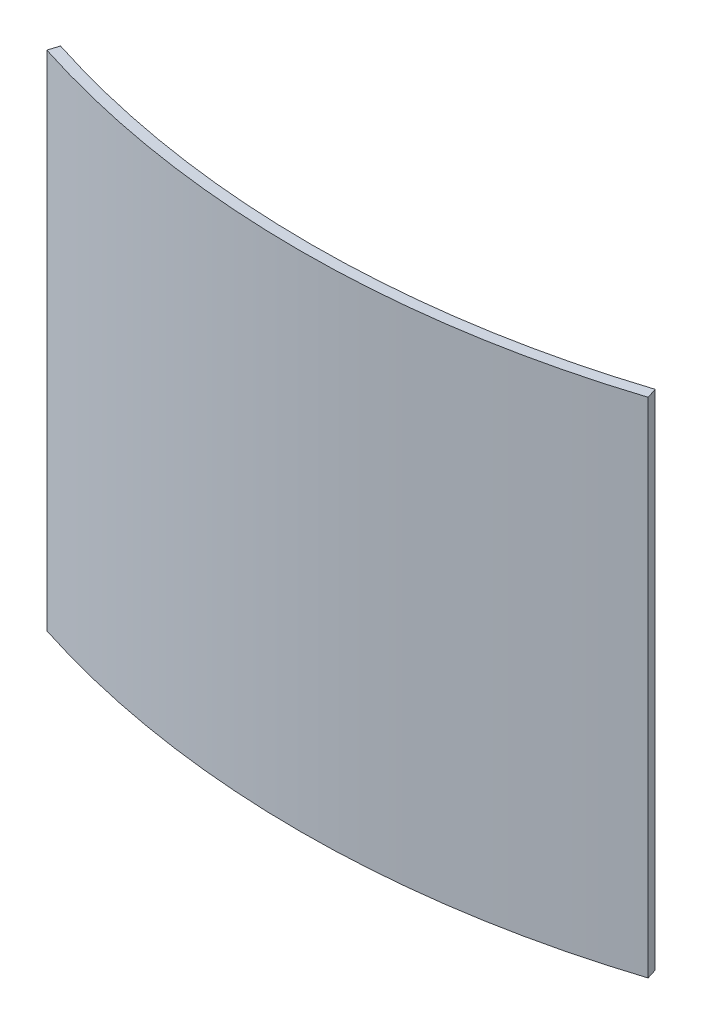
ISO-10303-21;
HEADER;
FILE_DESCRIPTION(('STEP AP214'),'2;1');
FILE_NAME('part.step','',(''),(''),'','','');
FILE_SCHEMA(('AUTOMOTIVE_DESIGN { 1 0 10303 214 1 1 1 1 }'));
ENDSEC;
DATA;
#1=APPLICATION_CONTEXT('core data for automotive mechanical design processes');
#2=APPLICATION_PROTOCOL_DEFINITION('international standard','automotive_design',2000,#1);
#3=PRODUCT_CONTEXT('',#1,'mechanical');
#4=PRODUCT('Part','Part','',(#3));
#5=PRODUCT_RELATED_PRODUCT_CATEGORY('part','',(#4));
#6=PRODUCT_DEFINITION_FORMATION('','',#4);
#7=PRODUCT_DEFINITION_CONTEXT('part definition',#1,'design');
#8=PRODUCT_DEFINITION('design','',#6,#7);
#9=PRODUCT_DEFINITION_SHAPE('','',#8);
#10=(LENGTH_UNIT() NAMED_UNIT(*) SI_UNIT(.MILLI.,.METRE.));
#11=(NAMED_UNIT(*) PLANE_ANGLE_UNIT() SI_UNIT($,.RADIAN.));
#12=(NAMED_UNIT(*) SI_UNIT($,.STERADIAN.) SOLID_ANGLE_UNIT());
#13=UNCERTAINTY_MEASURE_WITH_UNIT(LENGTH_MEASURE(1.E-05),#10,'distance_accuracy_value','');
#14=(GEOMETRIC_REPRESENTATION_CONTEXT(3) GLOBAL_UNCERTAINTY_ASSIGNED_CONTEXT((#13)) GLOBAL_UNIT_ASSIGNED_CONTEXT((#10,
#11,#12)) REPRESENTATION_CONTEXT('',''));
#15=CARTESIAN_POINT('',(0.,0.,0.));
#16=DIRECTION('',(0.,0.,1.));
#17=DIRECTION('',(1.,0.,0.));
#18=AXIS2_PLACEMENT_3D('',#15,#16,#17);
#19=CARTESIAN_POINT('',(0.,-230.,-856.956825050131));
#20=DIRECTION('',(0.,1.,0.));
#21=DIRECTION('',(0.,0.,1.));
#22=AXIS2_PLACEMENT_3D('',#19,#20,#21);
#23=CYLINDRICAL_SURFACE('',#22,890.);
#24=DIRECTION('',(0.,1.,0.));
#25=VECTOR('',#24,1.);
#26=CARTESIAN_POINT('',(-271.944444444444,-230.,-9.52174250055693));
#27=LINE('',#26,#25);
#28=CARTESIAN_POINT('',(-271.944444444444,-230.,-9.52174250055693));
#29=VERTEX_POINT('',#28);
#30=CARTESIAN_POINT('',(-271.944444444444,230.,-9.52174250055693));
#31=VERTEX_POINT('',#30);
#32=EDGE_CURVE('E45',#29,#31,#27,.T.);
#33=ORIENTED_EDGE('',*,*,#32,.T.);
#34=CARTESIAN_POINT('',(0.,230.,-856.956825050131));
#35=DIRECTION('',(0.,1.,0.));
#36=DIRECTION('',(1.,0.,0.));
#37=AXIS2_PLACEMENT_3D('',#34,#35,#36);
#38=CIRCLE('',#37,890.);
#39=CARTESIAN_POINT('',(271.944444444444,230.,-9.52174250055682));
#40=VERTEX_POINT('',#39);
#41=EDGE_CURVE('E82',#40,#31,#38,.F.);
#42=ORIENTED_EDGE('',*,*,#41,.F.);
#43=DIRECTION('',(0.,1.,0.));
#44=VECTOR('',#43,1.);
#45=CARTESIAN_POINT('',(271.944444444444,-230.,-9.52174250055682));
#46=LINE('',#45,#44);
#47=CARTESIAN_POINT('',(271.944444444444,-230.,-9.52174250055682));
#48=VERTEX_POINT('',#47);
#49=EDGE_CURVE('E11',#48,#40,#46,.T.);
#50=ORIENTED_EDGE('',*,*,#49,.F.);
#51=CARTESIAN_POINT('',(0.,-230.,-856.956825050131));
#52=DIRECTION('',(0.,1.,0.));
#53=DIRECTION('',(1.,0.,0.));
#54=AXIS2_PLACEMENT_3D('',#51,#52,#53);
#55=CIRCLE('',#54,890.);
#56=EDGE_CURVE('E84',#48,#29,#55,.F.);
#57=ORIENTED_EDGE('',*,*,#56,.T.);
#58=EDGE_LOOP('',(#33,#42,#50,#57));
#59=FACE_BOUND('',#58,.T.);
#60=ADVANCED_FACE('F42',(#59),#23,.F.);
#61=CARTESIAN_POINT('',(271.944444444444,-230.,-9.52174250055682));
#62=DIRECTION('',(-0.95217425005568,0.,0.305555555555619));
#63=DIRECTION('',(0.305555555555619,0.,0.95217425005568));
#64=AXIS2_PLACEMENT_3D('',#61,#62,#63);
#65=PLANE('',#64);
#66=ORIENTED_EDGE('',*,*,#49,.T.);
#67=DIRECTION('',(0.305555555555619,0.,0.95217425005568));
#68=VECTOR('',#67,1.);
#69=CARTESIAN_POINT('',(271.944444444444,230.,-9.52174250055682));
#70=LINE('',#69,#68);
#71=CARTESIAN_POINT('',(275.,230.,0.));
#72=VERTEX_POINT('',#71);
#73=EDGE_CURVE('E96',#40,#72,#70,.T.);
#74=ORIENTED_EDGE('',*,*,#73,.T.);
#75=DIRECTION('',(0.,1.,0.));
#76=VECTOR('',#75,1.);
#77=CARTESIAN_POINT('',(275.,-230.,0.));
#78=LINE('',#77,#76);
#79=CARTESIAN_POINT('',(275.,-230.,0.));
#80=VERTEX_POINT('',#79);
#81=EDGE_CURVE('E50',#80,#72,#78,.T.);
#82=ORIENTED_EDGE('',*,*,#81,.F.);
#83=DIRECTION('',(0.305555555555619,0.,0.95217425005568));
#84=VECTOR('',#83,1.);
#85=CARTESIAN_POINT('',(271.944444444444,-230.,-9.52174250055682));
#86=LINE('',#85,#84);
#87=EDGE_CURVE('E63',#48,#80,#86,.T.);
#88=ORIENTED_EDGE('',*,*,#87,.F.);
#89=EDGE_LOOP('',(#66,#74,#82,#88));
#90=FACE_BOUND('',#89,.T.);
#91=ADVANCED_FACE('F115',(#90),#65,.F.);
#92=CARTESIAN_POINT('',(0.,-230.,-856.956825050131));
#93=DIRECTION('',(0.,1.,0.));
#94=DIRECTION('',(0.,0.,1.));
#95=AXIS2_PLACEMENT_3D('',#92,#93,#94);
#96=CYLINDRICAL_SURFACE('',#95,900.);
#97=ORIENTED_EDGE('',*,*,#81,.T.);
#98=CARTESIAN_POINT('',(0.,230.,-856.956825050131));
#99=DIRECTION('',(0.,-1.,0.));
#100=DIRECTION('',(0.,0.,-1.));
#101=AXIS2_PLACEMENT_3D('',#98,#99,#100);
#102=CIRCLE('',#101,900.);
#103=CARTESIAN_POINT('',(-275.,230.,1.11022302462516E-13));
#104=VERTEX_POINT('',#103);
#105=EDGE_CURVE('E100',#72,#104,#102,.T.);
#106=ORIENTED_EDGE('',*,*,#105,.T.);
#107=DIRECTION('',(0.,1.,0.));
#108=VECTOR('',#107,1.);
#109=CARTESIAN_POINT('',(-275.,-230.,1.11022302462516E-13));
#110=LINE('',#109,#108);
#111=CARTESIAN_POINT('',(-275.,-230.,1.11022302462516E-13));
#112=VERTEX_POINT('',#111);
#113=EDGE_CURVE('E88',#112,#104,#110,.T.);
#114=ORIENTED_EDGE('',*,*,#113,.F.);
#115=CARTESIAN_POINT('',(0.,-230.,-856.956825050131));
#116=DIRECTION('',(0.,-1.,0.));
#117=DIRECTION('',(0.,0.,-1.));
#118=AXIS2_PLACEMENT_3D('',#115,#116,#117);
#119=CIRCLE('',#118,900.);
#120=EDGE_CURVE('E108',#80,#112,#119,.T.);
#121=ORIENTED_EDGE('',*,*,#120,.F.);
#122=EDGE_LOOP('',(#97,#106,#114,#121));
#123=FACE_BOUND('',#122,.T.);
#124=ADVANCED_FACE('F113',(#123),#96,.T.);
#125=CARTESIAN_POINT('',(-275.,-230.,1.11022302462516E-13));
#126=DIRECTION('',(0.952174250055697,0.,0.305555555555568));
#127=DIRECTION('',(0.305555555555568,0.,-0.952174250055697));
#128=AXIS2_PLACEMENT_3D('',#125,#126,#127);
#129=PLANE('',#128);
#130=ORIENTED_EDGE('',*,*,#113,.T.);
#131=DIRECTION('',(0.305555555555568,0.,-0.952174250055697));
#132=VECTOR('',#131,1.);
#133=CARTESIAN_POINT('',(-275.,230.,1.11022302462516E-13));
#134=LINE('',#133,#132);
#135=EDGE_CURVE('E93',#104,#31,#134,.T.);
#136=ORIENTED_EDGE('',*,*,#135,.T.);
#137=ORIENTED_EDGE('',*,*,#32,.F.);
#138=DIRECTION('',(0.305555555555568,0.,-0.952174250055697));
#139=VECTOR('',#138,1.);
#140=CARTESIAN_POINT('',(-275.,-230.,1.11022302462516E-13));
#141=LINE('',#140,#139);
#142=EDGE_CURVE('E106',#112,#29,#141,.T.);
#143=ORIENTED_EDGE('',*,*,#142,.F.);
#144=EDGE_LOOP('',(#130,#136,#137,#143));
#145=FACE_BOUND('',#144,.T.);
#146=ADVANCED_FACE('F98',(#145),#129,.F.);
#147=CARTESIAN_POINT('',(0.,-230.,-856.956825050131));
#148=DIRECTION('',(0.,1.,0.));
#149=DIRECTION('',(1.,0.,0.));
#150=AXIS2_PLACEMENT_3D('',#147,#148,#149);
#151=PLANE('',#150);
#152=ORIENTED_EDGE('',*,*,#56,.F.);
#153=ORIENTED_EDGE('',*,*,#87,.T.);
#154=ORIENTED_EDGE('',*,*,#120,.T.);
#155=ORIENTED_EDGE('',*,*,#142,.T.);
#156=EDGE_LOOP('',(#152,#153,#154,#155));
#157=FACE_BOUND('',#156,.T.);
#158=ADVANCED_FACE('F116',(#157),#151,.F.);
#159=CARTESIAN_POINT('',(0.,230.,-856.956825050131));
#160=DIRECTION('',(0.,1.,0.));
#161=DIRECTION('',(1.,0.,0.));
#162=AXIS2_PLACEMENT_3D('',#159,#160,#161);
#163=PLANE('',#162);
#164=ORIENTED_EDGE('',*,*,#41,.T.);
#165=ORIENTED_EDGE('',*,*,#135,.F.);
#166=ORIENTED_EDGE('',*,*,#105,.F.);
#167=ORIENTED_EDGE('',*,*,#73,.F.);
#168=EDGE_LOOP('',(#164,#165,#166,#167));
#169=FACE_BOUND('',#168,.T.);
#170=ADVANCED_FACE('F91',(#169),#163,.T.);
#171=CLOSED_SHELL('',(#60,#91,#124,#146,#158,#170));
#172=MANIFOLD_SOLID_BREP('B2',#171);
#173=ADVANCED_BREP_SHAPE_REPRESENTATION('',(#18,#172),#14);
#174=SHAPE_DEFINITION_REPRESENTATION(#9,#173);
ENDSEC;
END-ISO-10303-21;
